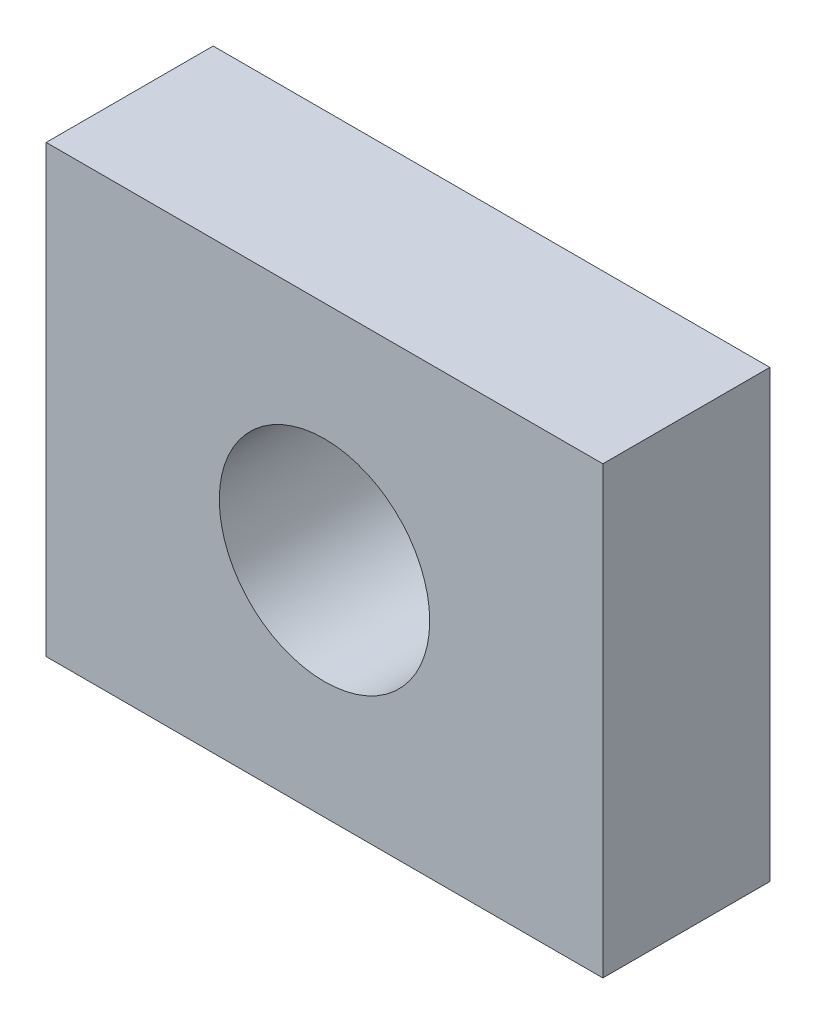
ISO-10303-21;
HEADER;
FILE_DESCRIPTION(('STEP AP214'),'2;1');
FILE_NAME('part.step','',(''),(''),'','','');
FILE_SCHEMA(('AUTOMOTIVE_DESIGN { 1 0 10303 214 1 1 1 1 }'));
ENDSEC;
DATA;
#1=APPLICATION_CONTEXT('core data for automotive mechanical design processes');
#2=APPLICATION_PROTOCOL_DEFINITION('international standard','automotive_design',2000,#1);
#3=PRODUCT_CONTEXT('',#1,'mechanical');
#4=PRODUCT('Part','Part','',(#3));
#5=PRODUCT_RELATED_PRODUCT_CATEGORY('part','',(#4));
#6=PRODUCT_DEFINITION_FORMATION('','',#4);
#7=PRODUCT_DEFINITION_CONTEXT('part definition',#1,'design');
#8=PRODUCT_DEFINITION('design','',#6,#7);
#9=PRODUCT_DEFINITION_SHAPE('','',#8);
#10=(LENGTH_UNIT() NAMED_UNIT(*) SI_UNIT(.MILLI.,.METRE.));
#11=(NAMED_UNIT(*) PLANE_ANGLE_UNIT() SI_UNIT($,.RADIAN.));
#12=(NAMED_UNIT(*) SI_UNIT($,.STERADIAN.) SOLID_ANGLE_UNIT());
#13=UNCERTAINTY_MEASURE_WITH_UNIT(LENGTH_MEASURE(1.E-05),#10,'distance_accuracy_value','');
#14=(GEOMETRIC_REPRESENTATION_CONTEXT(3) GLOBAL_UNCERTAINTY_ASSIGNED_CONTEXT((#13)) GLOBAL_UNIT_ASSIGNED_CONTEXT((#10,
#11,#12)) REPRESENTATION_CONTEXT('',''));
#15=CARTESIAN_POINT('',(0.,0.,0.));
#16=DIRECTION('',(0.,0.,1.));
#17=DIRECTION('',(1.,0.,0.));
#18=AXIS2_PLACEMENT_3D('',#15,#16,#17);
#19=CARTESIAN_POINT('',(0.,0.,9.525));
#20=DIRECTION('',(0.,0.,-1.));
#21=DIRECTION('',(-1.,0.,0.));
#22=AXIS2_PLACEMENT_3D('',#19,#20,#21);
#23=PLANE('',#22);
#24=DIRECTION('',(0.,1.,0.));
#25=VECTOR('',#24,1.);
#26=CARTESIAN_POINT('',(15.875,-12.7,9.525));
#27=LINE('',#26,#25);
#28=CARTESIAN_POINT('',(15.875,-12.7,9.525));
#29=VERTEX_POINT('',#28);
#30=CARTESIAN_POINT('',(15.875,12.7,9.525));
#31=VERTEX_POINT('',#30);
#32=EDGE_CURVE('E85',#29,#31,#27,.T.);
#33=ORIENTED_EDGE('',*,*,#32,.T.);
#34=DIRECTION('',(-1.,0.,0.));
#35=VECTOR('',#34,1.);
#36=CARTESIAN_POINT('',(-15.875,12.7,9.525));
#37=LINE('',#36,#35);
#38=CARTESIAN_POINT('',(-15.875,12.7,9.525));
#39=VERTEX_POINT('',#38);
#40=EDGE_CURVE('E80',#31,#39,#37,.T.);
#41=ORIENTED_EDGE('',*,*,#40,.T.);
#42=DIRECTION('',(0.,-1.,0.));
#43=VECTOR('',#42,1.);
#44=CARTESIAN_POINT('',(-15.875,-12.7,9.525));
#45=LINE('',#44,#43);
#46=CARTESIAN_POINT('',(-15.875,-12.7,9.525));
#47=VERTEX_POINT('',#46);
#48=EDGE_CURVE('E83',#39,#47,#45,.T.);
#49=ORIENTED_EDGE('',*,*,#48,.T.);
#50=DIRECTION('',(1.,0.,0.));
#51=VECTOR('',#50,1.);
#52=CARTESIAN_POINT('',(-15.875,-12.7,9.525));
#53=LINE('',#52,#51);
#54=EDGE_CURVE('E50',#47,#29,#53,.T.);
#55=ORIENTED_EDGE('',*,*,#54,.T.);
#56=EDGE_LOOP('',(#33,#41,#49,#55));
#57=FACE_BOUND('',#56,.T.);
#58=CARTESIAN_POINT('',(0.,0.,9.525));
#59=DIRECTION('',(0.,0.,1.));
#60=DIRECTION('',(1.,0.,0.));
#61=AXIS2_PLACEMENT_3D('',#58,#59,#60);
#62=CIRCLE('',#61,6.);
#63=CARTESIAN_POINT('',(-6.,0.,9.525));
#64=VERTEX_POINT('',#63);
#65=EDGE_CURVE('E100',#64,#64,#62,.T.);
#66=ORIENTED_EDGE('',*,*,#65,.F.);
#67=EDGE_LOOP('',(#66));
#68=FACE_BOUND('',#67,.T.);
#69=ADVANCED_FACE('F33',(#57,#68),#23,.F.);
#70=CARTESIAN_POINT('',(0.,0.,0.));
#71=DIRECTION('',(0.,0.,-1.));
#72=DIRECTION('',(-1.,0.,0.));
#73=AXIS2_PLACEMENT_3D('',#70,#71,#72);
#74=PLANE('',#73);
#75=DIRECTION('',(0.,1.,0.));
#76=VECTOR('',#75,1.);
#77=CARTESIAN_POINT('',(15.875,-12.7,0.));
#78=LINE('',#77,#76);
#79=CARTESIAN_POINT('',(15.875,-12.7,0.));
#80=VERTEX_POINT('',#79);
#81=CARTESIAN_POINT('',(15.875,12.7,0.));
#82=VERTEX_POINT('',#81);
#83=EDGE_CURVE('E97',#80,#82,#78,.T.);
#84=ORIENTED_EDGE('',*,*,#83,.F.);
#85=DIRECTION('',(1.,0.,0.));
#86=VECTOR('',#85,1.);
#87=CARTESIAN_POINT('',(-15.875,-12.7,0.));
#88=LINE('',#87,#86);
#89=CARTESIAN_POINT('',(-15.875,-12.7,0.));
#90=VERTEX_POINT('',#89);
#91=EDGE_CURVE('E73',#90,#80,#88,.T.);
#92=ORIENTED_EDGE('',*,*,#91,.F.);
#93=DIRECTION('',(0.,-1.,0.));
#94=VECTOR('',#93,1.);
#95=CARTESIAN_POINT('',(-15.875,-12.7,0.));
#96=LINE('',#95,#94);
#97=CARTESIAN_POINT('',(-15.875,12.7,0.));
#98=VERTEX_POINT('',#97);
#99=EDGE_CURVE('E67',#98,#90,#96,.T.);
#100=ORIENTED_EDGE('',*,*,#99,.F.);
#101=DIRECTION('',(-1.,0.,0.));
#102=VECTOR('',#101,1.);
#103=CARTESIAN_POINT('',(-15.875,12.7,0.));
#104=LINE('',#103,#102);
#105=EDGE_CURVE('E89',#82,#98,#104,.T.);
#106=ORIENTED_EDGE('',*,*,#105,.F.);
#107=EDGE_LOOP('',(#84,#92,#100,#106));
#108=FACE_BOUND('',#107,.T.);
#109=CARTESIAN_POINT('',(0.,0.,0.));
#110=DIRECTION('',(0.,0.,1.));
#111=DIRECTION('',(1.,0.,0.));
#112=AXIS2_PLACEMENT_3D('',#109,#110,#111);
#113=CIRCLE('',#112,6.);
#114=CARTESIAN_POINT('',(-6.,0.,0.));
#115=VERTEX_POINT('',#114);
#116=EDGE_CURVE('E112',#115,#115,#113,.T.);
#117=ORIENTED_EDGE('',*,*,#116,.T.);
#118=EDGE_LOOP('',(#117));
#119=FACE_BOUND('',#118,.T.);
#120=ADVANCED_FACE('F108',(#108,#119),#74,.T.);
#121=CARTESIAN_POINT('',(15.875,-12.7,9.525));
#122=DIRECTION('',(-1.,0.,0.));
#123=DIRECTION('',(0.,0.,1.));
#124=AXIS2_PLACEMENT_3D('',#121,#122,#123);
#125=PLANE('',#124);
#126=ORIENTED_EDGE('',*,*,#83,.T.);
#127=DIRECTION('',(0.,0.,-1.));
#128=VECTOR('',#127,1.);
#129=CARTESIAN_POINT('',(15.875,12.7,9.525));
#130=LINE('',#129,#128);
#131=EDGE_CURVE('E11',#31,#82,#130,.T.);
#132=ORIENTED_EDGE('',*,*,#131,.F.);
#133=ORIENTED_EDGE('',*,*,#32,.F.);
#134=DIRECTION('',(0.,0.,-1.));
#135=VECTOR('',#134,1.);
#136=CARTESIAN_POINT('',(15.875,-12.7,9.525));
#137=LINE('',#136,#135);
#138=EDGE_CURVE('E93',#29,#80,#137,.T.);
#139=ORIENTED_EDGE('',*,*,#138,.T.);
#140=EDGE_LOOP('',(#126,#132,#133,#139));
#141=FACE_BOUND('',#140,.T.);
#142=ADVANCED_FACE('F35',(#141),#125,.F.);
#143=CARTESIAN_POINT('',(-15.875,12.7,9.525));
#144=DIRECTION('',(0.,-1.,0.));
#145=DIRECTION('',(0.,0.,-1.));
#146=AXIS2_PLACEMENT_3D('',#143,#144,#145);
#147=PLANE('',#146);
#148=ORIENTED_EDGE('',*,*,#105,.T.);
#149=DIRECTION('',(0.,0.,-1.));
#150=VECTOR('',#149,1.);
#151=CARTESIAN_POINT('',(-15.875,12.7,9.525));
#152=LINE('',#151,#150);
#153=EDGE_CURVE('E42',#39,#98,#152,.T.);
#154=ORIENTED_EDGE('',*,*,#153,.F.);
#155=ORIENTED_EDGE('',*,*,#40,.F.);
#156=ORIENTED_EDGE('',*,*,#131,.T.);
#157=EDGE_LOOP('',(#148,#154,#155,#156));
#158=FACE_BOUND('',#157,.T.);
#159=ADVANCED_FACE('F88',(#158),#147,.F.);
#160=CARTESIAN_POINT('',(-15.875,-12.7,9.525));
#161=DIRECTION('',(1.,0.,0.));
#162=DIRECTION('',(0.,0.,-1.));
#163=AXIS2_PLACEMENT_3D('',#160,#161,#162);
#164=PLANE('',#163);
#165=ORIENTED_EDGE('',*,*,#99,.T.);
#166=DIRECTION('',(0.,0.,-1.));
#167=VECTOR('',#166,1.);
#168=CARTESIAN_POINT('',(-15.875,-12.7,9.525));
#169=LINE('',#168,#167);
#170=EDGE_CURVE('E90',#47,#90,#169,.T.);
#171=ORIENTED_EDGE('',*,*,#170,.F.);
#172=ORIENTED_EDGE('',*,*,#48,.F.);
#173=ORIENTED_EDGE('',*,*,#153,.T.);
#174=EDGE_LOOP('',(#165,#171,#172,#173));
#175=FACE_BOUND('',#174,.T.);
#176=ADVANCED_FACE('F91',(#175),#164,.F.);
#177=CARTESIAN_POINT('',(-15.875,-12.7,9.525));
#178=DIRECTION('',(0.,1.,0.));
#179=DIRECTION('',(0.,0.,1.));
#180=AXIS2_PLACEMENT_3D('',#177,#178,#179);
#181=PLANE('',#180);
#182=ORIENTED_EDGE('',*,*,#91,.T.);
#183=ORIENTED_EDGE('',*,*,#138,.F.);
#184=ORIENTED_EDGE('',*,*,#54,.F.);
#185=ORIENTED_EDGE('',*,*,#170,.T.);
#186=EDGE_LOOP('',(#182,#183,#184,#185));
#187=FACE_BOUND('',#186,.T.);
#188=ADVANCED_FACE('F105',(#187),#181,.F.);
#189=CARTESIAN_POINT('',(0.,0.,9.525));
#190=DIRECTION('',(0.,0.,-1.));
#191=DIRECTION('',(-1.,0.,0.));
#192=AXIS2_PLACEMENT_3D('',#189,#190,#191);
#193=CYLINDRICAL_SURFACE('',#192,6.);
#194=CARTESIAN_POINT('',(-6.,0.,9.525));
#195=CARTESIAN_POINT('',(-6.,0.,9.42578125));
#196=CARTESIAN_POINT('',(-6.,0.,9.3265625));
#197=CARTESIAN_POINT('',(-6.,0.,9.128125));
#198=CARTESIAN_POINT('',(-6.,0.,9.02890625));
#199=CARTESIAN_POINT('',(-6.,0.,8.83046875));
#200=CARTESIAN_POINT('',(-6.,0.,8.73125));
#201=CARTESIAN_POINT('',(-6.,0.,8.5328125));
#202=CARTESIAN_POINT('',(-6.,0.,8.43359375));
#203=CARTESIAN_POINT('',(-6.,0.,8.23515625));
#204=CARTESIAN_POINT('',(-6.,0.,8.1359375));
#205=CARTESIAN_POINT('',(-6.,0.,7.9375));
#206=CARTESIAN_POINT('',(-6.,0.,7.83828125));
#207=CARTESIAN_POINT('',(-6.,0.,7.63984375));
#208=CARTESIAN_POINT('',(-6.,0.,7.540625));
#209=CARTESIAN_POINT('',(-6.,0.,7.3421875));
#210=CARTESIAN_POINT('',(-6.,0.,7.24296875));
#211=CARTESIAN_POINT('',(-6.,0.,7.04453125));
#212=CARTESIAN_POINT('',(-6.,0.,6.9453125));
#213=CARTESIAN_POINT('',(-6.,0.,6.746875));
#214=CARTESIAN_POINT('',(-6.,0.,6.64765625));
#215=CARTESIAN_POINT('',(-6.,0.,6.44921875));
#216=CARTESIAN_POINT('',(-6.,0.,6.35));
#217=CARTESIAN_POINT('',(-6.,0.,6.1515625));
#218=CARTESIAN_POINT('',(-6.,0.,6.05234375));
#219=CARTESIAN_POINT('',(-6.,0.,5.85390625));
#220=CARTESIAN_POINT('',(-6.,0.,5.7546875));
#221=CARTESIAN_POINT('',(-6.,0.,5.55625));
#222=CARTESIAN_POINT('',(-6.,0.,5.45703125));
#223=CARTESIAN_POINT('',(-6.,0.,5.25859375));
#224=CARTESIAN_POINT('',(-6.,0.,5.159375));
#225=CARTESIAN_POINT('',(-6.,0.,4.9609375));
#226=CARTESIAN_POINT('',(-6.,0.,4.86171875));
#227=CARTESIAN_POINT('',(-6.,0.,4.66328125));
#228=CARTESIAN_POINT('',(-6.,0.,4.5640625));
#229=CARTESIAN_POINT('',(-6.,0.,4.365625));
#230=CARTESIAN_POINT('',(-6.,0.,4.26640625));
#231=CARTESIAN_POINT('',(-6.,0.,4.06796875));
#232=CARTESIAN_POINT('',(-6.,0.,3.96875));
#233=CARTESIAN_POINT('',(-6.,0.,3.7703125));
#234=CARTESIAN_POINT('',(-6.,0.,3.67109375));
#235=CARTESIAN_POINT('',(-6.,0.,3.47265625));
#236=CARTESIAN_POINT('',(-6.,0.,3.3734375));
#237=CARTESIAN_POINT('',(-6.,0.,3.175));
#238=CARTESIAN_POINT('',(-6.,0.,3.07578125));
#239=CARTESIAN_POINT('',(-6.,0.,2.87734375));
#240=CARTESIAN_POINT('',(-6.,0.,2.778125));
#241=CARTESIAN_POINT('',(-6.,0.,2.5796875));
#242=CARTESIAN_POINT('',(-6.,0.,2.48046875));
#243=CARTESIAN_POINT('',(-6.,0.,2.28203125));
#244=CARTESIAN_POINT('',(-6.,0.,2.1828125));
#245=CARTESIAN_POINT('',(-6.,0.,1.984375));
#246=CARTESIAN_POINT('',(-6.,0.,1.88515625));
#247=CARTESIAN_POINT('',(-6.,0.,1.68671875));
#248=CARTESIAN_POINT('',(-6.,0.,1.5875));
#249=CARTESIAN_POINT('',(-6.,0.,1.3890625));
#250=CARTESIAN_POINT('',(-6.,0.,1.28984375));
#251=CARTESIAN_POINT('',(-6.,0.,1.09140625));
#252=CARTESIAN_POINT('',(-6.,0.,0.992187500000001));
#253=CARTESIAN_POINT('',(-6.,0.,0.793750000000001));
#254=CARTESIAN_POINT('',(-6.,0.,0.69453125));
#255=CARTESIAN_POINT('',(-6.,0.,0.49609375));
#256=CARTESIAN_POINT('',(-6.,0.,0.396875));
#257=CARTESIAN_POINT('',(-6.,0.,0.1984375));
#258=CARTESIAN_POINT('',(-6.,0.,0.0992187500000001));
#259=CARTESIAN_POINT('',(-6.,0.,0.));
#260=B_SPLINE_CURVE_WITH_KNOTS('',3,(#194,#195,#196,#197,#198,#199,#200,#201,#202,#203,#204,
#205,#206,#207,#208,#209,#210,#211,#212,#213,#214,#215,#216,#217,#218,#219,#220,#221,#222,#223,
#224,#225,#226,#227,#228,#229,#230,#231,#232,#233,#234,#235,#236,#237,#238,#239,#240,#241,#242,
#243,#244,#245,#246,#247,#248,#249,#250,#251,#252,#253,#254,#255,#256,#257,#258,#259),
.UNSPECIFIED.,.F.,.F.,(4,2,2,2,2,2,2,2,2,2,2,2,2,2,2,2,2,2,2,2,2,2,2,2,2,2,2,2,2,2,2,2,4),(0.,
0.29765625,0.5953125,0.892968750000001,1.190625,1.48828125,1.7859375,2.08359375,2.38125,
2.67890625,2.9765625,3.27421875,3.571875,3.86953125,4.1671875,4.46484375,4.7625,5.06015625,
5.3578125,5.65546875,5.953125,6.25078125,6.5484375,6.84609375,7.14375,7.44140625,7.7390625,
8.03671875,8.334375,8.63203125,8.9296875,9.22734375,9.525),.UNSPECIFIED.);
#261=EDGE_CURVE('BSEAM118',#64,#115,#260,.T.);
#262=ORIENTED_EDGE('',*,*,#65,.T.);
#263=ORIENTED_EDGE('',*,*,#116,.F.);
#264=ORIENTED_EDGE('',*,*,#261,.T.);
#265=ORIENTED_EDGE('',*,*,#261,.F.);
#266=EDGE_LOOP('',(#262,#264,#263,#265));
#267=FACE_BOUND('',#266,.T.);
#268=ADVANCED_FACE('F118',(#267),#193,.F.);
#269=CLOSED_SHELL('',(#69,#120,#142,#159,#176,#188,#268));
#270=MANIFOLD_SOLID_BREP('B2',#269);
#271=ADVANCED_BREP_SHAPE_REPRESENTATION('',(#18,#270),#14);
#272=SHAPE_DEFINITION_REPRESENTATION(#9,#271);
ENDSEC;
END-ISO-10303-21;
